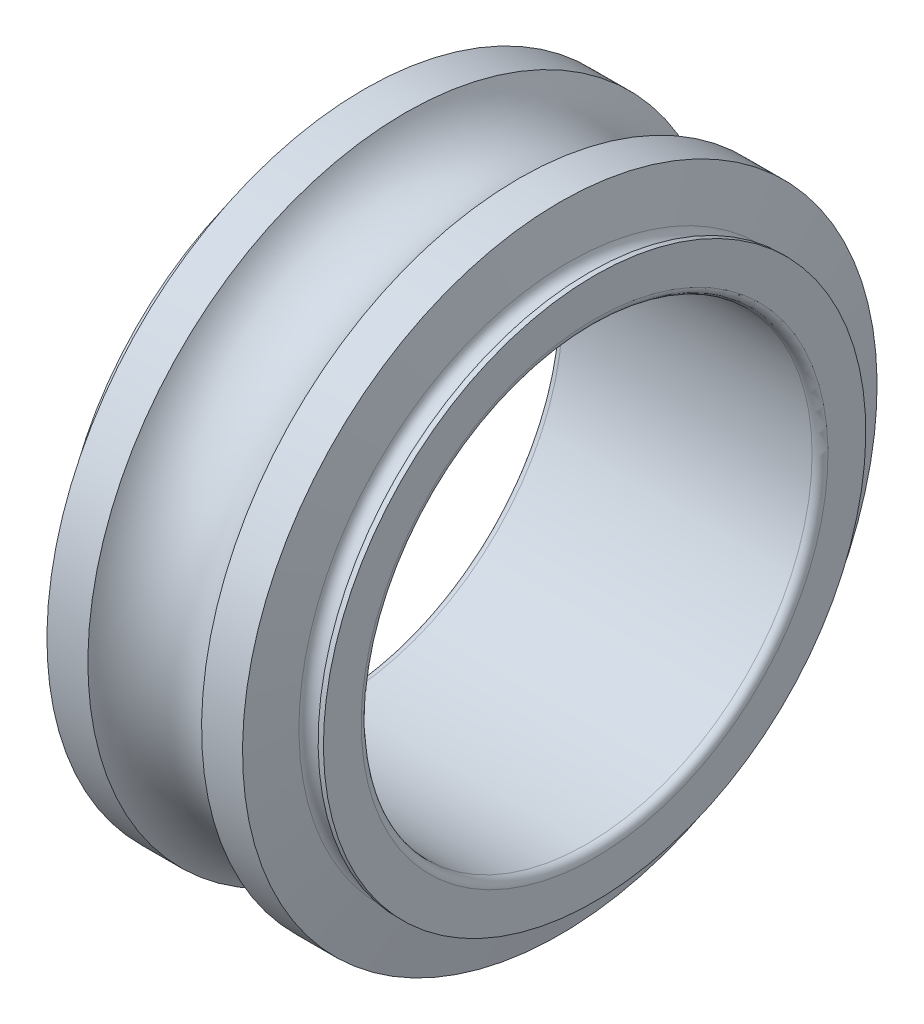
ISO-10303-21;
HEADER;
FILE_DESCRIPTION(('STEP AP214'),'2;1');
FILE_NAME('part.step','',(''),(''),'','','');
FILE_SCHEMA(('AUTOMOTIVE_DESIGN { 1 0 10303 214 1 1 1 1 }'));
ENDSEC;
DATA;
#1=APPLICATION_CONTEXT('core data for automotive mechanical design processes');
#2=APPLICATION_PROTOCOL_DEFINITION('international standard','automotive_design',2000,#1);
#3=PRODUCT_CONTEXT('',#1,'mechanical');
#4=PRODUCT('Part','Part','',(#3));
#5=PRODUCT_RELATED_PRODUCT_CATEGORY('part','',(#4));
#6=PRODUCT_DEFINITION_FORMATION('','',#4);
#7=PRODUCT_DEFINITION_CONTEXT('part definition',#1,'design');
#8=PRODUCT_DEFINITION('design','',#6,#7);
#9=PRODUCT_DEFINITION_SHAPE('','',#8);
#10=(LENGTH_UNIT() NAMED_UNIT(*) SI_UNIT(.MILLI.,.METRE.));
#11=(NAMED_UNIT(*) PLANE_ANGLE_UNIT() SI_UNIT($,.RADIAN.));
#12=(NAMED_UNIT(*) SI_UNIT($,.STERADIAN.) SOLID_ANGLE_UNIT());
#13=UNCERTAINTY_MEASURE_WITH_UNIT(LENGTH_MEASURE(1.E-05),#10,'distance_accuracy_value','');
#14=(GEOMETRIC_REPRESENTATION_CONTEXT(3) GLOBAL_UNCERTAINTY_ASSIGNED_CONTEXT((#13)) GLOBAL_UNIT_ASSIGNED_CONTEXT((#10,
#11,#12)) REPRESENTATION_CONTEXT('',''));
#15=CARTESIAN_POINT('',(0.,0.,0.));
#16=DIRECTION('',(0.,0.,1.));
#17=DIRECTION('',(1.,0.,0.));
#18=AXIS2_PLACEMENT_3D('',#15,#16,#17);
#19=CARTESIAN_POINT('',(7.91538162174607,0.,0.));
#20=DIRECTION('',(-1.,0.,0.));
#21=DIRECTION('',(0.,1.,0.));
#22=AXIS2_PLACEMENT_3D('',#19,#20,#21);
#23=CYLINDRICAL_SURFACE('',#22,11.96325);
#24=CARTESIAN_POINT('',(7.14343426246293,0.,0.));
#25=DIRECTION('',(1.,0.,0.));
#26=DIRECTION('',(0.,1.,0.));
#27=AXIS2_PLACEMENT_3D('',#24,#25,#26);
#28=CIRCLE('',#27,11.96325);
#29=CARTESIAN_POINT('',(7.14343426246293,11.96325,0.));
#30=VERTEX_POINT('',#29);
#31=EDGE_CURVE('E11',#30,#30,#28,.T.);
#32=ORIENTED_EDGE('',*,*,#31,.T.);
#33=EDGE_LOOP('',(#32));
#34=FACE_BOUND('',#33,.T.);
#35=CARTESIAN_POINT('',(8.68732898102921,0.,0.));
#36=DIRECTION('',(1.,0.,0.));
#37=DIRECTION('',(0.,1.,0.));
#38=AXIS2_PLACEMENT_3D('',#35,#36,#37);
#39=CIRCLE('',#38,11.96325);
#40=CARTESIAN_POINT('',(8.68732898102921,11.96325,0.));
#41=VERTEX_POINT('',#40);
#42=EDGE_CURVE('E57',#41,#41,#39,.T.);
#43=ORIENTED_EDGE('',*,*,#42,.F.);
#44=EDGE_LOOP('',(#43));
#45=FACE_BOUND('',#44,.T.);
#46=ADVANCED_FACE('F17',(#34,#45),#23,.T.);
#47=CARTESIAN_POINT('',(5.,0.,0.));
#48=DIRECTION('',(1.,0.,0.));
#49=DIRECTION('',(0.,0.,-1.));
#50=AXIS2_PLACEMENT_3D('',#47,#48,#49);
#51=TOROIDAL_SURFACE('',#50,13.,2.381);
#52=CARTESIAN_POINT('',(2.85656573753707,0.,0.));
#53=DIRECTION('',(1.,0.,0.));
#54=DIRECTION('',(0.,1.,0.));
#55=AXIS2_PLACEMENT_3D('',#52,#53,#54);
#56=CIRCLE('',#55,11.96325);
#57=CARTESIAN_POINT('',(2.85656573753707,11.96325,0.));
#58=VERTEX_POINT('',#57);
#59=EDGE_CURVE('E27',#58,#58,#56,.T.);
#60=ORIENTED_EDGE('',*,*,#59,.T.);
#61=EDGE_LOOP('',(#60));
#62=FACE_BOUND('',#61,.T.);
#63=ORIENTED_EDGE('',*,*,#31,.F.);
#64=EDGE_LOOP('',(#63));
#65=FACE_BOUND('',#64,.T.);
#66=ADVANCED_FACE('F119',(#62,#65),#51,.F.);
#67=CARTESIAN_POINT('',(2.08461837825393,0.,0.));
#68=DIRECTION('',(-1.,0.,0.));
#69=DIRECTION('',(0.,1.,0.));
#70=AXIS2_PLACEMENT_3D('',#67,#68,#69);
#71=CYLINDRICAL_SURFACE('',#70,11.96325);
#72=CARTESIAN_POINT('',(1.31267101897079,0.,0.));
#73=DIRECTION('',(1.,0.,0.));
#74=DIRECTION('',(0.,1.,0.));
#75=AXIS2_PLACEMENT_3D('',#72,#73,#74);
#76=CIRCLE('',#75,11.96325);
#77=CARTESIAN_POINT('',(1.31267101897079,11.96325,0.));
#78=VERTEX_POINT('',#77);
#79=EDGE_CURVE('E77',#78,#78,#76,.T.);
#80=ORIENTED_EDGE('',*,*,#79,.T.);
#81=EDGE_LOOP('',(#80));
#82=FACE_BOUND('',#81,.T.);
#83=ORIENTED_EDGE('',*,*,#59,.F.);
#84=EDGE_LOOP('',(#83));
#85=FACE_BOUND('',#84,.T.);
#86=ADVANCED_FACE('F78',(#82,#85),#71,.T.);
#87=CARTESIAN_POINT('',(1.15329706008784,0.,0.));
#88=DIRECTION('',(1.,0.,0.));
#89=DIRECTION('',(0.,1.,0.));
#90=AXIS2_PLACEMENT_3D('',#87,#88,#89);
#91=CONICAL_SURFACE('',#90,11.0593953644666,1.39626340159546);
#92=CARTESIAN_POINT('',(0.993923101204883,0.,0.));
#93=DIRECTION('',(1.,0.,0.));
#94=DIRECTION('',(0.,1.,0.));
#95=AXIS2_PLACEMENT_3D('',#92,#93,#94);
#96=CIRCLE('',#95,10.1555407289332);
#97=CARTESIAN_POINT('',(0.993923101204883,10.1555407289332,0.));
#98=VERTEX_POINT('',#97);
#99=EDGE_CURVE('E72',#98,#98,#96,.T.);
#100=ORIENTED_EDGE('',*,*,#99,.T.);
#101=EDGE_LOOP('',(#100));
#102=FACE_BOUND('',#101,.T.);
#103=ORIENTED_EDGE('',*,*,#79,.F.);
#104=EDGE_LOOP('',(#103));
#105=FACE_BOUND('',#104,.T.);
#106=ADVANCED_FACE('F139',(#102,#105),#91,.T.);
#107=CARTESIAN_POINT('',(0.6,0.,0.));
#108=DIRECTION('',(1.,0.,0.));
#109=DIRECTION('',(0.,0.,-1.));
#110=AXIS2_PLACEMENT_3D('',#107,#108,#109);
#111=TOROIDAL_SURFACE('',#110,10.225,0.4);
#112=CARTESIAN_POINT('',(0.2,0.,0.));
#113=DIRECTION('',(1.,0.,0.));
#114=DIRECTION('',(0.,1.,0.));
#115=AXIS2_PLACEMENT_3D('',#112,#113,#114);
#116=CIRCLE('',#115,10.225);
#117=CARTESIAN_POINT('',(0.2,10.225,0.));
#118=VERTEX_POINT('',#117);
#119=EDGE_CURVE('E83',#118,#118,#116,.T.);
#120=ORIENTED_EDGE('',*,*,#119,.T.);
#121=EDGE_LOOP('',(#120));
#122=FACE_BOUND('',#121,.T.);
#123=ORIENTED_EDGE('',*,*,#99,.F.);
#124=EDGE_LOOP('',(#123));
#125=FACE_BOUND('',#124,.T.);
#126=ADVANCED_FACE('F135',(#122,#125),#111,.F.);
#127=CARTESIAN_POINT('',(0.1,0.,0.));
#128=DIRECTION('',(-1.,0.,0.));
#129=DIRECTION('',(0.,1.,0.));
#130=AXIS2_PLACEMENT_3D('',#127,#128,#129);
#131=CYLINDRICAL_SURFACE('',#130,10.225);
#132=CARTESIAN_POINT('',(0.,0.,0.));
#133=DIRECTION('',(1.,0.,0.));
#134=DIRECTION('',(0.,1.,0.));
#135=AXIS2_PLACEMENT_3D('',#132,#133,#134);
#136=CIRCLE('',#135,10.225);
#137=CARTESIAN_POINT('',(0.,10.225,0.));
#138=VERTEX_POINT('',#137);
#139=EDGE_CURVE('E86',#138,#138,#136,.T.);
#140=ORIENTED_EDGE('',*,*,#139,.T.);
#141=EDGE_LOOP('',(#140));
#142=FACE_BOUND('',#141,.T.);
#143=ORIENTED_EDGE('',*,*,#119,.F.);
#144=EDGE_LOOP('',(#143));
#145=FACE_BOUND('',#144,.T.);
#146=ADVANCED_FACE('F138',(#142,#145),#131,.T.);
#147=CARTESIAN_POINT('',(0.,9.5125,0.));
#148=DIRECTION('',(-1.,0.,0.));
#149=DIRECTION('',(0.,-1.,0.));
#150=AXIS2_PLACEMENT_3D('',#147,#148,#149);
#151=PLANE('',#150);
#152=CARTESIAN_POINT('',(0.,0.,0.));
#153=DIRECTION('',(1.,0.,0.));
#154=DIRECTION('',(0.,1.,0.));
#155=AXIS2_PLACEMENT_3D('',#152,#153,#154);
#156=CIRCLE('',#155,8.8);
#157=CARTESIAN_POINT('',(0.,8.8,0.));
#158=VERTEX_POINT('',#157);
#159=EDGE_CURVE('E89',#158,#158,#156,.T.);
#160=ORIENTED_EDGE('',*,*,#159,.T.);
#161=EDGE_LOOP('',(#160));
#162=FACE_BOUND('',#161,.T.);
#163=ORIENTED_EDGE('',*,*,#139,.F.);
#164=EDGE_LOOP('',(#163));
#165=FACE_BOUND('',#164,.T.);
#166=ADVANCED_FACE('F143',(#162,#165),#151,.T.);
#167=CARTESIAN_POINT('',(0.3,0.,0.));
#168=DIRECTION('',(1.,0.,0.));
#169=DIRECTION('',(0.,0.,-1.));
#170=AXIS2_PLACEMENT_3D('',#167,#168,#169);
#171=TOROIDAL_SURFACE('',#170,8.8,0.3);
#172=CARTESIAN_POINT('',(0.3,0.,0.));
#173=DIRECTION('',(1.,0.,0.));
#174=DIRECTION('',(0.,1.,0.));
#175=AXIS2_PLACEMENT_3D('',#172,#173,#174);
#176=CIRCLE('',#175,8.5);
#177=CARTESIAN_POINT('',(0.3,8.5,0.));
#178=VERTEX_POINT('',#177);
#179=EDGE_CURVE('E87',#178,#178,#176,.T.);
#180=ORIENTED_EDGE('',*,*,#179,.T.);
#181=EDGE_LOOP('',(#180));
#182=FACE_BOUND('',#181,.T.);
#183=ORIENTED_EDGE('',*,*,#159,.F.);
#184=EDGE_LOOP('',(#183));
#185=FACE_BOUND('',#184,.T.);
#186=ADVANCED_FACE('F133',(#182,#185),#171,.T.);
#187=CARTESIAN_POINT('',(5.,0.,0.));
#188=DIRECTION('',(-1.,0.,0.));
#189=DIRECTION('',(0.,1.,0.));
#190=AXIS2_PLACEMENT_3D('',#187,#188,#189);
#191=CYLINDRICAL_SURFACE('',#190,8.5);
#192=CARTESIAN_POINT('',(9.7,0.,0.));
#193=DIRECTION('',(1.,0.,0.));
#194=DIRECTION('',(0.,1.,0.));
#195=AXIS2_PLACEMENT_3D('',#192,#193,#194);
#196=CIRCLE('',#195,8.5);
#197=CARTESIAN_POINT('',(9.7,8.5,0.));
#198=VERTEX_POINT('',#197);
#199=EDGE_CURVE('E90',#198,#198,#196,.T.);
#200=ORIENTED_EDGE('',*,*,#199,.T.);
#201=EDGE_LOOP('',(#200));
#202=FACE_BOUND('',#201,.T.);
#203=ORIENTED_EDGE('',*,*,#179,.F.);
#204=EDGE_LOOP('',(#203));
#205=FACE_BOUND('',#204,.T.);
#206=ADVANCED_FACE('F129',(#202,#205),#191,.F.);
#207=CARTESIAN_POINT('',(9.7,0.,0.));
#208=DIRECTION('',(1.,0.,0.));
#209=DIRECTION('',(0.,0.,-1.));
#210=AXIS2_PLACEMENT_3D('',#207,#208,#209);
#211=TOROIDAL_SURFACE('',#210,8.8,0.3);
#212=CARTESIAN_POINT('',(10.,0.,0.));
#213=DIRECTION('',(1.,0.,0.));
#214=DIRECTION('',(0.,1.,0.));
#215=AXIS2_PLACEMENT_3D('',#212,#213,#214);
#216=CIRCLE('',#215,8.8);
#217=CARTESIAN_POINT('',(10.,8.8,0.));
#218=VERTEX_POINT('',#217);
#219=EDGE_CURVE('E94',#218,#218,#216,.T.);
#220=ORIENTED_EDGE('',*,*,#219,.T.);
#221=EDGE_LOOP('',(#220));
#222=FACE_BOUND('',#221,.T.);
#223=ORIENTED_EDGE('',*,*,#199,.F.);
#224=EDGE_LOOP('',(#223));
#225=FACE_BOUND('',#224,.T.);
#226=ADVANCED_FACE('F132',(#222,#225),#211,.T.);
#227=CARTESIAN_POINT('',(10.,9.5125,0.));
#228=DIRECTION('',(1.,0.,0.));
#229=DIRECTION('',(0.,1.,0.));
#230=AXIS2_PLACEMENT_3D('',#227,#228,#229);
#231=PLANE('',#230);
#232=CARTESIAN_POINT('',(10.,0.,0.));
#233=DIRECTION('',(1.,0.,0.));
#234=DIRECTION('',(0.,1.,0.));
#235=AXIS2_PLACEMENT_3D('',#232,#233,#234);
#236=CIRCLE('',#235,10.225);
#237=CARTESIAN_POINT('',(10.,10.225,0.));
#238=VERTEX_POINT('',#237);
#239=EDGE_CURVE('E97',#238,#238,#236,.T.);
#240=ORIENTED_EDGE('',*,*,#239,.T.);
#241=EDGE_LOOP('',(#240));
#242=FACE_BOUND('',#241,.T.);
#243=ORIENTED_EDGE('',*,*,#219,.F.);
#244=EDGE_LOOP('',(#243));
#245=FACE_BOUND('',#244,.T.);
#246=ADVANCED_FACE('F116',(#242,#245),#231,.T.);
#247=CARTESIAN_POINT('',(9.9,0.,0.));
#248=DIRECTION('',(-1.,0.,0.));
#249=DIRECTION('',(0.,1.,0.));
#250=AXIS2_PLACEMENT_3D('',#247,#248,#249);
#251=CYLINDRICAL_SURFACE('',#250,10.225);
#252=CARTESIAN_POINT('',(9.8,0.,0.));
#253=DIRECTION('',(1.,0.,0.));
#254=DIRECTION('',(0.,1.,0.));
#255=AXIS2_PLACEMENT_3D('',#252,#253,#254);
#256=CIRCLE('',#255,10.225);
#257=CARTESIAN_POINT('',(9.8,10.225,0.));
#258=VERTEX_POINT('',#257);
#259=EDGE_CURVE('E21',#258,#258,#256,.T.);
#260=ORIENTED_EDGE('',*,*,#259,.T.);
#261=EDGE_LOOP('',(#260));
#262=FACE_BOUND('',#261,.T.);
#263=ORIENTED_EDGE('',*,*,#239,.F.);
#264=EDGE_LOOP('',(#263));
#265=FACE_BOUND('',#264,.T.);
#266=ADVANCED_FACE('F105',(#262,#265),#251,.T.);
#267=CARTESIAN_POINT('',(9.4,0.,0.));
#268=DIRECTION('',(1.,0.,0.));
#269=DIRECTION('',(0.,0.,-1.));
#270=AXIS2_PLACEMENT_3D('',#267,#268,#269);
#271=TOROIDAL_SURFACE('',#270,10.225,0.4);
#272=CARTESIAN_POINT('',(9.00607689879512,0.,0.));
#273=DIRECTION('',(1.,0.,0.));
#274=DIRECTION('',(0.,1.,0.));
#275=AXIS2_PLACEMENT_3D('',#272,#273,#274);
#276=CIRCLE('',#275,10.1555407289332);
#277=CARTESIAN_POINT('',(9.00607689879512,10.1555407289332,0.));
#278=VERTEX_POINT('',#277);
#279=EDGE_CURVE('E52',#278,#278,#276,.T.);
#280=ORIENTED_EDGE('',*,*,#279,.T.);
#281=EDGE_LOOP('',(#280));
#282=FACE_BOUND('',#281,.T.);
#283=ORIENTED_EDGE('',*,*,#259,.F.);
#284=EDGE_LOOP('',(#283));
#285=FACE_BOUND('',#284,.T.);
#286=ADVANCED_FACE('F19',(#282,#285),#271,.F.);
#287=CARTESIAN_POINT('',(8.84670293991217,0.,0.));
#288=DIRECTION('',(-1.,0.,0.));
#289=DIRECTION('',(0.,1.,0.));
#290=AXIS2_PLACEMENT_3D('',#287,#288,#289);
#291=CONICAL_SURFACE('',#290,11.0593953644666,1.39626340159546);
#292=ORIENTED_EDGE('',*,*,#42,.T.);
#293=EDGE_LOOP('',(#292));
#294=FACE_BOUND('',#293,.T.);
#295=ORIENTED_EDGE('',*,*,#279,.F.);
#296=EDGE_LOOP('',(#295));
#297=FACE_BOUND('',#296,.T.);
#298=ADVANCED_FACE('F109',(#294,#297),#291,.T.);
#299=CLOSED_SHELL('',(#46,#66,#86,#106,#126,#146,#166,#186,#206,#226,#246,#266,#286,#298));
#300=MANIFOLD_SOLID_BREP('B1',#299);
#301=ADVANCED_BREP_SHAPE_REPRESENTATION('',(#18,#300),#14);
#302=SHAPE_DEFINITION_REPRESENTATION(#9,#301);
ENDSEC;
END-ISO-10303-21;
